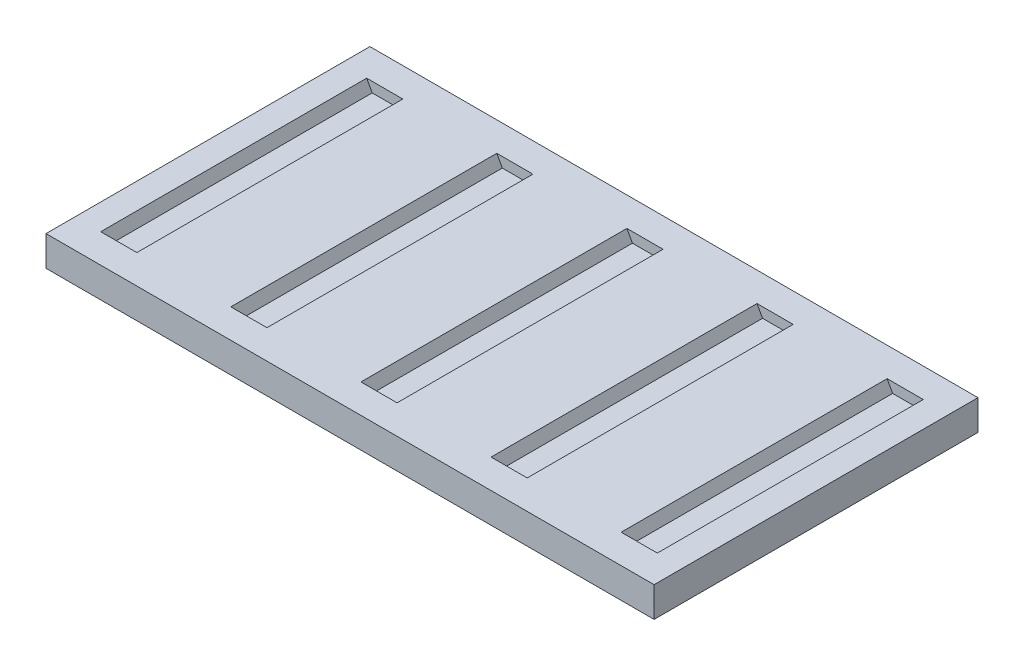
ISO-10303-21;
HEADER;
FILE_DESCRIPTION(('STEP AP214'),'2;1');
FILE_NAME('part.step','',(''),(''),'','','');
FILE_SCHEMA(('AUTOMOTIVE_DESIGN { 1 0 10303 214 1 1 1 1 }'));
ENDSEC;
DATA;
#1=APPLICATION_CONTEXT('core data for automotive mechanical design processes');
#2=APPLICATION_PROTOCOL_DEFINITION('international standard','automotive_design',2000,#1);
#3=PRODUCT_CONTEXT('',#1,'mechanical');
#4=PRODUCT('Part','Part','',(#3));
#5=PRODUCT_RELATED_PRODUCT_CATEGORY('part','',(#4));
#6=PRODUCT_DEFINITION_FORMATION('','',#4);
#7=PRODUCT_DEFINITION_CONTEXT('part definition',#1,'design');
#8=PRODUCT_DEFINITION('design','',#6,#7);
#9=PRODUCT_DEFINITION_SHAPE('','',#8);
#10=(LENGTH_UNIT() NAMED_UNIT(*) SI_UNIT(.MILLI.,.METRE.));
#11=(NAMED_UNIT(*) PLANE_ANGLE_UNIT() SI_UNIT($,.RADIAN.));
#12=(NAMED_UNIT(*) SI_UNIT($,.STERADIAN.) SOLID_ANGLE_UNIT());
#13=UNCERTAINTY_MEASURE_WITH_UNIT(LENGTH_MEASURE(1.E-05),#10,'distance_accuracy_value','');
#14=(GEOMETRIC_REPRESENTATION_CONTEXT(3) GLOBAL_UNCERTAINTY_ASSIGNED_CONTEXT((#13)) GLOBAL_UNIT_ASSIGNED_CONTEXT((#10,
#11,#12)) REPRESENTATION_CONTEXT('',''));
#15=CARTESIAN_POINT('',(0.,0.,0.));
#16=DIRECTION('',(0.,0.,1.));
#17=DIRECTION('',(1.,0.,0.));
#18=AXIS2_PLACEMENT_3D('',#15,#16,#17);
#19=CARTESIAN_POINT('',(242.360715672653,-15.,61.55));
#20=DIRECTION('',(1.,0.,0.));
#21=DIRECTION('',(0.,1.,0.));
#22=AXIS2_PLACEMENT_3D('',#19,#20,#21);
#23=PLANE('',#22);
#24=DIRECTION('',(0.,0.,1.));
#25=VECTOR('',#24,1.);
#26=CARTESIAN_POINT('',(242.360715672653,-6.,-64.55));
#27=LINE('',#26,#25);
#28=CARTESIAN_POINT('',(242.360715672653,-6.,-64.55));
#29=VERTEX_POINT('',#28);
#30=CARTESIAN_POINT('',(242.360715672653,-6.,64.55));
#31=VERTEX_POINT('',#30);
#32=EDGE_CURVE('E318',#29,#31,#27,.T.);
#33=ORIENTED_EDGE('',*,*,#32,.T.);
#34=DIRECTION('',(0.,-1.,0.));
#35=VECTOR('',#34,1.);
#36=CARTESIAN_POINT('',(242.360715672653,-15.,64.55));
#37=LINE('',#36,#35);
#38=CARTESIAN_POINT('',(242.360715672653,-18.,64.5500000000001));
#39=VERTEX_POINT('',#38);
#40=EDGE_CURVE('E341',#31,#39,#37,.T.);
#41=ORIENTED_EDGE('',*,*,#40,.T.);
#42=DIRECTION('',(0.,0.,1.));
#43=VECTOR('',#42,1.);
#44=CARTESIAN_POINT('',(242.360715672653,-18.,-64.55));
#45=LINE('',#44,#43);
#46=CARTESIAN_POINT('',(242.360715672653,-18.,-64.55));
#47=VERTEX_POINT('',#46);
#48=EDGE_CURVE('E321',#47,#39,#45,.T.);
#49=ORIENTED_EDGE('',*,*,#48,.F.);
#50=DIRECTION('',(0.,1.,0.));
#51=VECTOR('',#50,1.);
#52=CARTESIAN_POINT('',(242.360715672653,-18.,-64.55));
#53=LINE('',#52,#51);
#54=EDGE_CURVE('E332',#47,#29,#53,.T.);
#55=ORIENTED_EDGE('',*,*,#54,.T.);
#56=EDGE_LOOP('',(#33,#41,#49,#55));
#57=FACE_BOUND('',#56,.T.);
#58=ADVANCED_FACE('F39',(#57),#23,.T.);
#59=CARTESIAN_POINT('',(0.,-2.97600000000012,61.55));
#60=DIRECTION('',(-1.,0.,0.));
#61=DIRECTION('',(0.,-1.,0.));
#62=AXIS2_PLACEMENT_3D('',#59,#60,#61);
#63=PLANE('',#62);
#64=DIRECTION('',(0.,0.,1.));
#65=VECTOR('',#64,1.);
#66=CARTESIAN_POINT('',(0.,-6.,-64.55));
#67=LINE('',#66,#65);
#68=CARTESIAN_POINT('',(0.,-6.,-64.55));
#69=VERTEX_POINT('',#68);
#70=CARTESIAN_POINT('',(0.,-6.,64.55));
#71=VERTEX_POINT('',#70);
#72=EDGE_CURVE('E316',#69,#71,#67,.T.);
#73=ORIENTED_EDGE('',*,*,#72,.F.);
#74=DIRECTION('',(0.,1.,0.));
#75=VECTOR('',#74,1.);
#76=CARTESIAN_POINT('',(0.,-18.,-64.55));
#77=LINE('',#76,#75);
#78=CARTESIAN_POINT('',(0.,-18.,-64.55));
#79=VERTEX_POINT('',#78);
#80=EDGE_CURVE('E335',#79,#69,#77,.T.);
#81=ORIENTED_EDGE('',*,*,#80,.F.);
#82=DIRECTION('',(0.,0.,-1.));
#83=VECTOR('',#82,1.);
#84=CARTESIAN_POINT('',(0.,-18.,-64.55));
#85=LINE('',#84,#83);
#86=CARTESIAN_POINT('',(0.,-18.,64.55));
#87=VERTEX_POINT('',#86);
#88=EDGE_CURVE('E328',#87,#79,#85,.T.);
#89=ORIENTED_EDGE('',*,*,#88,.F.);
#90=DIRECTION('',(0.,1.,0.));
#91=VECTOR('',#90,1.);
#92=CARTESIAN_POINT('',(0.,-15.,64.55));
#93=LINE('',#92,#91);
#94=EDGE_CURVE('E338',#87,#71,#93,.T.);
#95=ORIENTED_EDGE('',*,*,#94,.T.);
#96=EDGE_LOOP('',(#73,#81,#89,#95));
#97=FACE_BOUND('',#96,.T.);
#98=ADVANCED_FACE('F41',(#97),#63,.T.);
#99=CARTESIAN_POINT('',(0.,0.,64.55));
#100=DIRECTION('',(0.,0.,1.));
#101=DIRECTION('',(-1.,0.,0.));
#102=AXIS2_PLACEMENT_3D('',#99,#100,#101);
#103=PLANE('',#102);
#104=DIRECTION('',(1.,0.,0.));
#105=VECTOR('',#104,1.);
#106=CARTESIAN_POINT('',(0.,-6.,64.55));
#107=LINE('',#106,#105);
#108=EDGE_CURVE('E229',#71,#31,#107,.T.);
#109=ORIENTED_EDGE('',*,*,#108,.F.);
#110=ORIENTED_EDGE('',*,*,#94,.F.);
#111=DIRECTION('',(-1.,0.,0.));
#112=VECTOR('',#111,1.);
#113=CARTESIAN_POINT('',(242.360715672653,-18.,64.5500000000001));
#114=LINE('',#113,#112);
#115=EDGE_CURVE('E325',#39,#87,#114,.T.);
#116=ORIENTED_EDGE('',*,*,#115,.F.);
#117=ORIENTED_EDGE('',*,*,#40,.F.);
#118=EDGE_LOOP('',(#109,#110,#116,#117));
#119=FACE_BOUND('',#118,.T.);
#120=ADVANCED_FACE('F415',(#119),#103,.T.);
#121=CARTESIAN_POINT('',(0.,-18.,0.));
#122=DIRECTION('',(0.,-1.,0.));
#123=DIRECTION('',(1.,0.,0.));
#124=AXIS2_PLACEMENT_3D('',#121,#122,#123);
#125=PLANE('',#124);
#126=ORIENTED_EDGE('',*,*,#88,.T.);
#127=DIRECTION('',(1.,0.,0.));
#128=VECTOR('',#127,1.);
#129=CARTESIAN_POINT('',(242.360715672653,-18.,-64.55));
#130=LINE('',#129,#128);
#131=EDGE_CURVE('E330',#79,#47,#130,.T.);
#132=ORIENTED_EDGE('',*,*,#131,.T.);
#133=ORIENTED_EDGE('',*,*,#48,.T.);
#134=ORIENTED_EDGE('',*,*,#115,.T.);
#135=EDGE_LOOP('',(#126,#132,#133,#134));
#136=FACE_BOUND('',#135,.T.);
#137=ADVANCED_FACE('F420',(#136),#125,.T.);
#138=CARTESIAN_POINT('',(242.360715672653,-18.,-64.55));
#139=DIRECTION('',(0.,0.,1.));
#140=DIRECTION('',(1.,0.,0.));
#141=AXIS2_PLACEMENT_3D('',#138,#139,#140);
#142=PLANE('',#141);
#143=ORIENTED_EDGE('',*,*,#80,.T.);
#144=DIRECTION('',(1.,0.,0.));
#145=VECTOR('',#144,1.);
#146=CARTESIAN_POINT('',(0.,-6.,-64.55));
#147=LINE('',#146,#145);
#148=EDGE_CURVE('E313',#69,#29,#147,.T.);
#149=ORIENTED_EDGE('',*,*,#148,.T.);
#150=ORIENTED_EDGE('',*,*,#54,.F.);
#151=ORIENTED_EDGE('',*,*,#131,.F.);
#152=EDGE_LOOP('',(#143,#149,#150,#151));
#153=FACE_BOUND('',#152,.T.);
#154=ADVANCED_FACE('F422',(#153),#142,.F.);
#155=CARTESIAN_POINT('',(0.,-6.,-64.55));
#156=DIRECTION('',(0.,-1.,0.));
#157=DIRECTION('',(0.,0.,-1.));
#158=AXIS2_PLACEMENT_3D('',#155,#156,#157);
#159=PLANE('',#158);
#160=DIRECTION('',(0.,0.,-1.));
#161=VECTOR('',#160,1.);
#162=CARTESIAN_POINT('',(10.2603578363264,-6.,-64.55));
#163=LINE('',#162,#161);
#164=CARTESIAN_POINT('',(10.2603578363264,-6.,53.));
#165=VERTEX_POINT('',#164);
#166=CARTESIAN_POINT('',(10.2603578363264,-6.,-53.));
#167=VERTEX_POINT('',#166);
#168=EDGE_CURVE('E47',#165,#167,#163,.T.);
#169=ORIENTED_EDGE('',*,*,#168,.T.);
#170=DIRECTION('',(1.,0.,0.));
#171=VECTOR('',#170,1.);
#172=CARTESIAN_POINT('',(0.,-6.,-53.));
#173=LINE('',#172,#171);
#174=CARTESIAN_POINT('',(24.6603578363263,-6.,-53.));
#175=VERTEX_POINT('',#174);
#176=EDGE_CURVE('E12',#167,#175,#173,.T.);
#177=ORIENTED_EDGE('',*,*,#176,.T.);
#178=DIRECTION('',(0.,0.,1.));
#179=VECTOR('',#178,1.);
#180=CARTESIAN_POINT('',(24.6603578363263,-6.,-64.55));
#181=LINE('',#180,#179);
#182=CARTESIAN_POINT('',(24.6603578363263,-6.,53.));
#183=VERTEX_POINT('',#182);
#184=EDGE_CURVE('E389',#175,#183,#181,.T.);
#185=ORIENTED_EDGE('',*,*,#184,.T.);
#186=DIRECTION('',(1.,0.,0.));
#187=VECTOR('',#186,1.);
#188=CARTESIAN_POINT('',(0.,-6.,53.));
#189=LINE('',#188,#187);
#190=EDGE_CURVE('E387',#165,#183,#189,.T.);
#191=ORIENTED_EDGE('',*,*,#190,.F.);
#192=EDGE_LOOP('',(#169,#177,#185,#191));
#193=FACE_BOUND('',#192,.T.);
#194=DIRECTION('',(0.,0.,-1.));
#195=VECTOR('',#194,1.);
#196=CARTESIAN_POINT('',(62.1203578363263,-6.,-64.55));
#197=LINE('',#196,#195);
#198=CARTESIAN_POINT('',(62.1203578363263,-6.,53.));
#199=VERTEX_POINT('',#198);
#200=CARTESIAN_POINT('',(62.1203578363263,-6.,-53.));
#201=VERTEX_POINT('',#200);
#202=EDGE_CURVE('E381',#199,#201,#197,.T.);
#203=ORIENTED_EDGE('',*,*,#202,.T.);
#204=DIRECTION('',(1.,0.,0.));
#205=VECTOR('',#204,1.);
#206=CARTESIAN_POINT('',(0.,-6.,-53.));
#207=LINE('',#206,#205);
#208=CARTESIAN_POINT('',(76.5203578363263,-6.,-53.));
#209=VERTEX_POINT('',#208);
#210=EDGE_CURVE('E384',#201,#209,#207,.T.);
#211=ORIENTED_EDGE('',*,*,#210,.T.);
#212=DIRECTION('',(0.,0.,1.));
#213=VECTOR('',#212,1.);
#214=CARTESIAN_POINT('',(76.5203578363263,-6.,-64.55));
#215=LINE('',#214,#213);
#216=CARTESIAN_POINT('',(76.5203578363263,-6.,53.));
#217=VERTEX_POINT('',#216);
#218=EDGE_CURVE('E378',#209,#217,#215,.T.);
#219=ORIENTED_EDGE('',*,*,#218,.T.);
#220=DIRECTION('',(1.,0.,0.));
#221=VECTOR('',#220,1.);
#222=CARTESIAN_POINT('',(0.,-6.,53.));
#223=LINE('',#222,#221);
#224=EDGE_CURVE('E376',#199,#217,#223,.T.);
#225=ORIENTED_EDGE('',*,*,#224,.F.);
#226=EDGE_LOOP('',(#203,#211,#219,#225));
#227=FACE_BOUND('',#226,.T.);
#228=DIRECTION('',(0.,0.,-1.));
#229=VECTOR('',#228,1.);
#230=CARTESIAN_POINT('',(113.980357836326,-6.,-64.55));
#231=LINE('',#230,#229);
#232=CARTESIAN_POINT('',(113.980357836326,-6.,53.));
#233=VERTEX_POINT('',#232);
#234=CARTESIAN_POINT('',(113.980357836326,-6.,-53.));
#235=VERTEX_POINT('',#234);
#236=EDGE_CURVE('E370',#233,#235,#231,.T.);
#237=ORIENTED_EDGE('',*,*,#236,.T.);
#238=DIRECTION('',(1.,0.,0.));
#239=VECTOR('',#238,1.);
#240=CARTESIAN_POINT('',(0.,-6.,-53.));
#241=LINE('',#240,#239);
#242=CARTESIAN_POINT('',(128.380357836326,-6.,-53.));
#243=VERTEX_POINT('',#242);
#244=EDGE_CURVE('E373',#235,#243,#241,.T.);
#245=ORIENTED_EDGE('',*,*,#244,.T.);
#246=DIRECTION('',(0.,0.,1.));
#247=VECTOR('',#246,1.);
#248=CARTESIAN_POINT('',(128.380357836326,-6.,-64.55));
#249=LINE('',#248,#247);
#250=CARTESIAN_POINT('',(128.380357836326,-6.,53.));
#251=VERTEX_POINT('',#250);
#252=EDGE_CURVE('E367',#243,#251,#249,.T.);
#253=ORIENTED_EDGE('',*,*,#252,.T.);
#254=DIRECTION('',(1.,0.,0.));
#255=VECTOR('',#254,1.);
#256=CARTESIAN_POINT('',(0.,-6.,53.));
#257=LINE('',#256,#255);
#258=EDGE_CURVE('E365',#233,#251,#257,.T.);
#259=ORIENTED_EDGE('',*,*,#258,.F.);
#260=EDGE_LOOP('',(#237,#245,#253,#259));
#261=FACE_BOUND('',#260,.T.);
#262=DIRECTION('',(0.,0.,-1.));
#263=VECTOR('',#262,1.);
#264=CARTESIAN_POINT('',(165.840357836326,-6.,-64.55));
#265=LINE('',#264,#263);
#266=CARTESIAN_POINT('',(165.840357836326,-6.,53.));
#267=VERTEX_POINT('',#266);
#268=CARTESIAN_POINT('',(165.840357836326,-6.,-53.));
#269=VERTEX_POINT('',#268);
#270=EDGE_CURVE('E359',#267,#269,#265,.T.);
#271=ORIENTED_EDGE('',*,*,#270,.T.);
#272=DIRECTION('',(1.,0.,0.));
#273=VECTOR('',#272,1.);
#274=CARTESIAN_POINT('',(0.,-6.,-53.));
#275=LINE('',#274,#273);
#276=CARTESIAN_POINT('',(180.240357836326,-6.,-53.));
#277=VERTEX_POINT('',#276);
#278=EDGE_CURVE('E362',#269,#277,#275,.T.);
#279=ORIENTED_EDGE('',*,*,#278,.T.);
#280=DIRECTION('',(0.,0.,1.));
#281=VECTOR('',#280,1.);
#282=CARTESIAN_POINT('',(180.240357836326,-6.,-64.55));
#283=LINE('',#282,#281);
#284=CARTESIAN_POINT('',(180.240357836326,-6.,53.));
#285=VERTEX_POINT('',#284);
#286=EDGE_CURVE('E356',#277,#285,#283,.T.);
#287=ORIENTED_EDGE('',*,*,#286,.T.);
#288=DIRECTION('',(1.,0.,0.));
#289=VECTOR('',#288,1.);
#290=CARTESIAN_POINT('',(0.,-6.,53.));
#291=LINE('',#290,#289);
#292=EDGE_CURVE('E354',#267,#285,#291,.T.);
#293=ORIENTED_EDGE('',*,*,#292,.F.);
#294=EDGE_LOOP('',(#271,#279,#287,#293));
#295=FACE_BOUND('',#294,.T.);
#296=DIRECTION('',(0.,0.,-1.));
#297=VECTOR('',#296,1.);
#298=CARTESIAN_POINT('',(217.700357836326,-6.,-64.55));
#299=LINE('',#298,#297);
#300=CARTESIAN_POINT('',(217.700357836326,-6.,53.));
#301=VERTEX_POINT('',#300);
#302=CARTESIAN_POINT('',(217.700357836326,-6.,-53.));
#303=VERTEX_POINT('',#302);
#304=EDGE_CURVE('E348',#301,#303,#299,.T.);
#305=ORIENTED_EDGE('',*,*,#304,.T.);
#306=DIRECTION('',(1.,0.,0.));
#307=VECTOR('',#306,1.);
#308=CARTESIAN_POINT('',(0.,-6.,-53.));
#309=LINE('',#308,#307);
#310=CARTESIAN_POINT('',(232.100357836326,-6.,-53.));
#311=VERTEX_POINT('',#310);
#312=EDGE_CURVE('E351',#303,#311,#309,.T.);
#313=ORIENTED_EDGE('',*,*,#312,.T.);
#314=DIRECTION('',(0.,0.,1.));
#315=VECTOR('',#314,1.);
#316=CARTESIAN_POINT('',(232.100357836326,-6.,-64.55));
#317=LINE('',#316,#315);
#318=CARTESIAN_POINT('',(232.100357836326,-6.,53.));
#319=VERTEX_POINT('',#318);
#320=EDGE_CURVE('E345',#311,#319,#317,.T.);
#321=ORIENTED_EDGE('',*,*,#320,.T.);
#322=DIRECTION('',(1.,0.,0.));
#323=VECTOR('',#322,1.);
#324=CARTESIAN_POINT('',(0.,-6.,53.));
#325=LINE('',#324,#323);
#326=EDGE_CURVE('E343',#301,#319,#325,.T.);
#327=ORIENTED_EDGE('',*,*,#326,.F.);
#328=EDGE_LOOP('',(#305,#313,#321,#327));
#329=FACE_BOUND('',#328,.T.);
#330=ORIENTED_EDGE('',*,*,#108,.T.);
#331=ORIENTED_EDGE('',*,*,#32,.F.);
#332=ORIENTED_EDGE('',*,*,#148,.F.);
#333=ORIENTED_EDGE('',*,*,#72,.T.);
#334=EDGE_LOOP('',(#330,#331,#332,#333));
#335=FACE_BOUND('',#334,.T.);
#336=ADVANCED_FACE('F393',(#193,#227,#261,#295,#329,#335),#159,.F.);
#337=CARTESIAN_POINT('',(219.900357836326,-9.99999999999997,-53.));
#338=DIRECTION('',(-0.876215908676645,-0.48191874977216,0.));
#339=DIRECTION('',(0.48191874977216,-0.876215908676645,0.));
#340=AXIS2_PLACEMENT_3D('',#337,#338,#339);
#341=PLANE('',#340);
#342=DIRECTION('',(0.48191874977216,-0.876215908676645,0.));
#343=VECTOR('',#342,1.);
#344=CARTESIAN_POINT('',(219.900357836326,-9.99999999999997,53.));
#345=LINE('',#344,#343);
#346=CARTESIAN_POINT('',(219.900357836326,-9.99999999999997,53.));
#347=VERTEX_POINT('',#346);
#348=EDGE_CURVE('E303',#301,#347,#345,.T.);
#349=ORIENTED_EDGE('',*,*,#348,.T.);
#350=DIRECTION('',(0.,0.,1.));
#351=VECTOR('',#350,1.);
#352=CARTESIAN_POINT('',(219.900357836326,-9.99999999999997,-53.));
#353=LINE('',#352,#351);
#354=CARTESIAN_POINT('',(219.900357836326,-9.99999999999997,-53.));
#355=VERTEX_POINT('',#354);
#356=EDGE_CURVE('E302',#355,#347,#353,.T.);
#357=ORIENTED_EDGE('',*,*,#356,.F.);
#358=DIRECTION('',(0.48191874977216,-0.876215908676645,0.));
#359=VECTOR('',#358,1.);
#360=CARTESIAN_POINT('',(219.900357836326,-9.99999999999997,-53.));
#361=LINE('',#360,#359);
#362=EDGE_CURVE('E293',#303,#355,#361,.T.);
#363=ORIENTED_EDGE('',*,*,#362,.F.);
#364=ORIENTED_EDGE('',*,*,#304,.F.);
#365=EDGE_LOOP('',(#349,#357,#363,#364));
#366=FACE_BOUND('',#365,.T.);
#367=ADVANCED_FACE('F431',(#366),#341,.F.);
#368=CARTESIAN_POINT('',(235.400357836326,0.,-53.));
#369=DIRECTION('',(0.876215908676649,-0.481918749772153,0.));
#370=DIRECTION('',(0.481918749772153,0.876215908676649,0.));
#371=AXIS2_PLACEMENT_3D('',#368,#369,#370);
#372=PLANE('',#371);
#373=DIRECTION('',(0.481918749772153,0.876215908676649,0.));
#374=VECTOR('',#373,1.);
#375=CARTESIAN_POINT('',(235.400357836326,0.,-53.));
#376=LINE('',#375,#374);
#377=CARTESIAN_POINT('',(229.900357836326,-9.99999999999997,-53.));
#378=VERTEX_POINT('',#377);
#379=EDGE_CURVE('E299',#378,#311,#376,.T.);
#380=ORIENTED_EDGE('',*,*,#379,.F.);
#381=DIRECTION('',(0.,0.,1.));
#382=VECTOR('',#381,1.);
#383=CARTESIAN_POINT('',(229.900357836326,-9.99999999999997,-53.));
#384=LINE('',#383,#382);
#385=CARTESIAN_POINT('',(229.900357836326,-9.99999999999997,53.));
#386=VERTEX_POINT('',#385);
#387=EDGE_CURVE('E285',#378,#386,#384,.T.);
#388=ORIENTED_EDGE('',*,*,#387,.T.);
#389=DIRECTION('',(0.481918749772153,0.876215908676649,0.));
#390=VECTOR('',#389,1.);
#391=CARTESIAN_POINT('',(235.400357836326,0.,53.));
#392=LINE('',#391,#390);
#393=EDGE_CURVE('E296',#386,#319,#392,.T.);
#394=ORIENTED_EDGE('',*,*,#393,.T.);
#395=ORIENTED_EDGE('',*,*,#320,.F.);
#396=EDGE_LOOP('',(#380,#388,#394,#395));
#397=FACE_BOUND('',#396,.T.);
#398=ADVANCED_FACE('F434',(#397),#372,.F.);
#399=CARTESIAN_POINT('',(0.,0.,-53.));
#400=DIRECTION('',(0.,0.,-1.));
#401=DIRECTION('',(-1.,0.,0.));
#402=AXIS2_PLACEMENT_3D('',#399,#400,#401);
#403=PLANE('',#402);
#404=ORIENTED_EDGE('',*,*,#362,.T.);
#405=DIRECTION('',(1.,0.,0.));
#406=VECTOR('',#405,1.);
#407=CARTESIAN_POINT('',(229.900357836326,-9.99999999999997,-53.));
#408=LINE('',#407,#406);
#409=EDGE_CURVE('E295',#355,#378,#408,.T.);
#410=ORIENTED_EDGE('',*,*,#409,.T.);
#411=ORIENTED_EDGE('',*,*,#379,.T.);
#412=ORIENTED_EDGE('',*,*,#312,.F.);
#413=EDGE_LOOP('',(#404,#410,#411,#412));
#414=FACE_BOUND('',#413,.T.);
#415=ADVANCED_FACE('F444',(#414),#403,.F.);
#416=CARTESIAN_POINT('',(0.,0.,53.));
#417=DIRECTION('',(0.,0.,-1.));
#418=DIRECTION('',(-1.,0.,0.));
#419=AXIS2_PLACEMENT_3D('',#416,#417,#418);
#420=PLANE('',#419);
#421=ORIENTED_EDGE('',*,*,#326,.T.);
#422=ORIENTED_EDGE('',*,*,#393,.F.);
#423=DIRECTION('',(1.,0.,0.));
#424=VECTOR('',#423,1.);
#425=CARTESIAN_POINT('',(229.900357836326,-9.99999999999997,53.));
#426=LINE('',#425,#424);
#427=EDGE_CURVE('E305',#347,#386,#426,.T.);
#428=ORIENTED_EDGE('',*,*,#427,.F.);
#429=ORIENTED_EDGE('',*,*,#348,.F.);
#430=EDGE_LOOP('',(#421,#422,#428,#429));
#431=FACE_BOUND('',#430,.T.);
#432=ADVANCED_FACE('F440',(#431),#420,.T.);
#433=CARTESIAN_POINT('',(229.900357836326,-9.99999999999997,-53.));
#434=DIRECTION('',(0.,-1.,0.));
#435=DIRECTION('',(0.,0.,-1.));
#436=AXIS2_PLACEMENT_3D('',#433,#434,#435);
#437=PLANE('',#436);
#438=ORIENTED_EDGE('',*,*,#427,.T.);
#439=ORIENTED_EDGE('',*,*,#387,.F.);
#440=ORIENTED_EDGE('',*,*,#409,.F.);
#441=ORIENTED_EDGE('',*,*,#356,.T.);
#442=EDGE_LOOP('',(#438,#439,#440,#441));
#443=FACE_BOUND('',#442,.T.);
#444=ADVANCED_FACE('F436',(#443),#437,.F.);
#445=CARTESIAN_POINT('',(168.040357836326,-9.99999999999997,-53.));
#446=DIRECTION('',(-0.876215908676646,-0.481918749772158,0.));
#447=DIRECTION('',(0.481918749772158,-0.876215908676646,0.));
#448=AXIS2_PLACEMENT_3D('',#445,#446,#447);
#449=PLANE('',#448);
#450=DIRECTION('',(0.481918749772158,-0.876215908676646,0.));
#451=VECTOR('',#450,1.);
#452=CARTESIAN_POINT('',(168.040357836326,-9.99999999999997,53.));
#453=LINE('',#452,#451);
#454=CARTESIAN_POINT('',(168.040357836326,-9.99999999999997,53.));
#455=VERTEX_POINT('',#454);
#456=EDGE_CURVE('E282',#267,#455,#453,.T.);
#457=ORIENTED_EDGE('',*,*,#456,.T.);
#458=DIRECTION('',(0.,0.,1.));
#459=VECTOR('',#458,1.);
#460=CARTESIAN_POINT('',(168.040357836326,-9.99999999999997,-53.));
#461=LINE('',#460,#459);
#462=CARTESIAN_POINT('',(168.040357836326,-9.99999999999997,-53.));
#463=VERTEX_POINT('',#462);
#464=EDGE_CURVE('E281',#463,#455,#461,.T.);
#465=ORIENTED_EDGE('',*,*,#464,.F.);
#466=DIRECTION('',(0.481918749772158,-0.876215908676646,0.));
#467=VECTOR('',#466,1.);
#468=CARTESIAN_POINT('',(168.040357836326,-9.99999999999997,-53.));
#469=LINE('',#468,#467);
#470=EDGE_CURVE('E272',#269,#463,#469,.T.);
#471=ORIENTED_EDGE('',*,*,#470,.F.);
#472=ORIENTED_EDGE('',*,*,#270,.F.);
#473=EDGE_LOOP('',(#457,#465,#471,#472));
#474=FACE_BOUND('',#473,.T.);
#475=ADVANCED_FACE('F439',(#474),#449,.F.);
#476=CARTESIAN_POINT('',(183.540357836326,0.,-53.));
#477=DIRECTION('',(0.876215908676648,-0.481918749772154,0.));
#478=DIRECTION('',(0.481918749772154,0.876215908676648,0.));
#479=AXIS2_PLACEMENT_3D('',#476,#477,#478);
#480=PLANE('',#479);
#481=DIRECTION('',(0.481918749772154,0.876215908676648,0.));
#482=VECTOR('',#481,1.);
#483=CARTESIAN_POINT('',(183.540357836326,0.,-53.));
#484=LINE('',#483,#482);
#485=CARTESIAN_POINT('',(178.040357836326,-9.99999999999997,-53.));
#486=VERTEX_POINT('',#485);
#487=EDGE_CURVE('E278',#486,#277,#484,.T.);
#488=ORIENTED_EDGE('',*,*,#487,.F.);
#489=DIRECTION('',(0.,0.,1.));
#490=VECTOR('',#489,1.);
#491=CARTESIAN_POINT('',(178.040357836326,-9.99999999999997,-53.));
#492=LINE('',#491,#490);
#493=CARTESIAN_POINT('',(178.040357836326,-9.99999999999997,53.));
#494=VERTEX_POINT('',#493);
#495=EDGE_CURVE('E264',#486,#494,#492,.T.);
#496=ORIENTED_EDGE('',*,*,#495,.T.);
#497=DIRECTION('',(0.481918749772154,0.876215908676648,0.));
#498=VECTOR('',#497,1.);
#499=CARTESIAN_POINT('',(183.540357836326,0.,53.));
#500=LINE('',#499,#498);
#501=EDGE_CURVE('E275',#494,#285,#500,.T.);
#502=ORIENTED_EDGE('',*,*,#501,.T.);
#503=ORIENTED_EDGE('',*,*,#286,.F.);
#504=EDGE_LOOP('',(#488,#496,#502,#503));
#505=FACE_BOUND('',#504,.T.);
#506=ADVANCED_FACE('F454',(#505),#480,.F.);
#507=CARTESIAN_POINT('',(0.,0.,-53.));
#508=DIRECTION('',(0.,0.,-1.));
#509=DIRECTION('',(-1.,0.,0.));
#510=AXIS2_PLACEMENT_3D('',#507,#508,#509);
#511=PLANE('',#510);
#512=ORIENTED_EDGE('',*,*,#470,.T.);
#513=DIRECTION('',(1.,0.,0.));
#514=VECTOR('',#513,1.);
#515=CARTESIAN_POINT('',(178.040357836326,-9.99999999999997,-53.));
#516=LINE('',#515,#514);
#517=EDGE_CURVE('E274',#463,#486,#516,.T.);
#518=ORIENTED_EDGE('',*,*,#517,.T.);
#519=ORIENTED_EDGE('',*,*,#487,.T.);
#520=ORIENTED_EDGE('',*,*,#278,.F.);
#521=EDGE_LOOP('',(#512,#518,#519,#520));
#522=FACE_BOUND('',#521,.T.);
#523=ADVANCED_FACE('F464',(#522),#511,.F.);
#524=CARTESIAN_POINT('',(0.,0.,53.));
#525=DIRECTION('',(0.,0.,-1.));
#526=DIRECTION('',(-1.,0.,0.));
#527=AXIS2_PLACEMENT_3D('',#524,#525,#526);
#528=PLANE('',#527);
#529=ORIENTED_EDGE('',*,*,#292,.T.);
#530=ORIENTED_EDGE('',*,*,#501,.F.);
#531=DIRECTION('',(1.,0.,0.));
#532=VECTOR('',#531,1.);
#533=CARTESIAN_POINT('',(178.040357836326,-9.99999999999997,53.));
#534=LINE('',#533,#532);
#535=EDGE_CURVE('E284',#455,#494,#534,.T.);
#536=ORIENTED_EDGE('',*,*,#535,.F.);
#537=ORIENTED_EDGE('',*,*,#456,.F.);
#538=EDGE_LOOP('',(#529,#530,#536,#537));
#539=FACE_BOUND('',#538,.T.);
#540=ADVANCED_FACE('F460',(#539),#528,.T.);
#541=CARTESIAN_POINT('',(178.040357836326,-9.99999999999997,-53.));
#542=DIRECTION('',(0.,-1.,0.));
#543=DIRECTION('',(0.,0.,-1.));
#544=AXIS2_PLACEMENT_3D('',#541,#542,#543);
#545=PLANE('',#544);
#546=ORIENTED_EDGE('',*,*,#535,.T.);
#547=ORIENTED_EDGE('',*,*,#495,.F.);
#548=ORIENTED_EDGE('',*,*,#517,.F.);
#549=ORIENTED_EDGE('',*,*,#464,.T.);
#550=EDGE_LOOP('',(#546,#547,#548,#549));
#551=FACE_BOUND('',#550,.T.);
#552=ADVANCED_FACE('F456',(#551),#545,.F.);
#553=CARTESIAN_POINT('',(116.180357836326,-9.99999999999997,-53.));
#554=DIRECTION('',(-0.876215908676646,-0.481918749772157,0.));
#555=DIRECTION('',(0.481918749772157,-0.876215908676646,0.));
#556=AXIS2_PLACEMENT_3D('',#553,#554,#555);
#557=PLANE('',#556);
#558=DIRECTION('',(0.481918749772157,-0.876215908676646,0.));
#559=VECTOR('',#558,1.);
#560=CARTESIAN_POINT('',(116.180357836326,-9.99999999999997,53.));
#561=LINE('',#560,#559);
#562=CARTESIAN_POINT('',(116.180357836326,-9.99999999999997,53.));
#563=VERTEX_POINT('',#562);
#564=EDGE_CURVE('E261',#233,#563,#561,.T.);
#565=ORIENTED_EDGE('',*,*,#564,.T.);
#566=DIRECTION('',(0.,0.,1.));
#567=VECTOR('',#566,1.);
#568=CARTESIAN_POINT('',(116.180357836326,-9.99999999999997,-53.));
#569=LINE('',#568,#567);
#570=CARTESIAN_POINT('',(116.180357836326,-9.99999999999997,-53.));
#571=VERTEX_POINT('',#570);
#572=EDGE_CURVE('E260',#571,#563,#569,.T.);
#573=ORIENTED_EDGE('',*,*,#572,.F.);
#574=DIRECTION('',(0.481918749772157,-0.876215908676646,0.));
#575=VECTOR('',#574,1.);
#576=CARTESIAN_POINT('',(116.180357836326,-9.99999999999997,-53.));
#577=LINE('',#576,#575);
#578=EDGE_CURVE('E251',#235,#571,#577,.T.);
#579=ORIENTED_EDGE('',*,*,#578,.F.);
#580=ORIENTED_EDGE('',*,*,#236,.F.);
#581=EDGE_LOOP('',(#565,#573,#579,#580));
#582=FACE_BOUND('',#581,.T.);
#583=ADVANCED_FACE('F459',(#582),#557,.F.);
#584=CARTESIAN_POINT('',(131.680357836326,0.,-53.));
#585=DIRECTION('',(0.876215908676648,-0.481918749772154,0.));
#586=DIRECTION('',(0.481918749772154,0.876215908676648,0.));
#587=AXIS2_PLACEMENT_3D('',#584,#585,#586);
#588=PLANE('',#587);
#589=DIRECTION('',(0.481918749772154,0.876215908676648,0.));
#590=VECTOR('',#589,1.);
#591=CARTESIAN_POINT('',(131.680357836326,0.,-53.));
#592=LINE('',#591,#590);
#593=CARTESIAN_POINT('',(126.180357836326,-9.99999999999997,-53.));
#594=VERTEX_POINT('',#593);
#595=EDGE_CURVE('E257',#594,#243,#592,.T.);
#596=ORIENTED_EDGE('',*,*,#595,.F.);
#597=DIRECTION('',(0.,0.,1.));
#598=VECTOR('',#597,1.);
#599=CARTESIAN_POINT('',(126.180357836326,-9.99999999999997,-53.));
#600=LINE('',#599,#598);
#601=CARTESIAN_POINT('',(126.180357836326,-9.99999999999997,53.));
#602=VERTEX_POINT('',#601);
#603=EDGE_CURVE('E243',#594,#602,#600,.T.);
#604=ORIENTED_EDGE('',*,*,#603,.T.);
#605=DIRECTION('',(0.481918749772154,0.876215908676648,0.));
#606=VECTOR('',#605,1.);
#607=CARTESIAN_POINT('',(131.680357836326,0.,53.));
#608=LINE('',#607,#606);
#609=EDGE_CURVE('E254',#602,#251,#608,.T.);
#610=ORIENTED_EDGE('',*,*,#609,.T.);
#611=ORIENTED_EDGE('',*,*,#252,.F.);
#612=EDGE_LOOP('',(#596,#604,#610,#611));
#613=FACE_BOUND('',#612,.T.);
#614=ADVANCED_FACE('F474',(#613),#588,.F.);
#615=CARTESIAN_POINT('',(0.,0.,-53.));
#616=DIRECTION('',(0.,0.,-1.));
#617=DIRECTION('',(-1.,0.,0.));
#618=AXIS2_PLACEMENT_3D('',#615,#616,#617);
#619=PLANE('',#618);
#620=ORIENTED_EDGE('',*,*,#578,.T.);
#621=DIRECTION('',(1.,0.,0.));
#622=VECTOR('',#621,1.);
#623=CARTESIAN_POINT('',(126.180357836326,-9.99999999999997,-53.));
#624=LINE('',#623,#622);
#625=EDGE_CURVE('E253',#571,#594,#624,.T.);
#626=ORIENTED_EDGE('',*,*,#625,.T.);
#627=ORIENTED_EDGE('',*,*,#595,.T.);
#628=ORIENTED_EDGE('',*,*,#244,.F.);
#629=EDGE_LOOP('',(#620,#626,#627,#628));
#630=FACE_BOUND('',#629,.T.);
#631=ADVANCED_FACE('F484',(#630),#619,.F.);
#632=CARTESIAN_POINT('',(0.,0.,53.));
#633=DIRECTION('',(0.,0.,-1.));
#634=DIRECTION('',(-1.,0.,0.));
#635=AXIS2_PLACEMENT_3D('',#632,#633,#634);
#636=PLANE('',#635);
#637=ORIENTED_EDGE('',*,*,#258,.T.);
#638=ORIENTED_EDGE('',*,*,#609,.F.);
#639=DIRECTION('',(1.,0.,0.));
#640=VECTOR('',#639,1.);
#641=CARTESIAN_POINT('',(126.180357836326,-9.99999999999997,53.));
#642=LINE('',#641,#640);
#643=EDGE_CURVE('E263',#563,#602,#642,.T.);
#644=ORIENTED_EDGE('',*,*,#643,.F.);
#645=ORIENTED_EDGE('',*,*,#564,.F.);
#646=EDGE_LOOP('',(#637,#638,#644,#645));
#647=FACE_BOUND('',#646,.T.);
#648=ADVANCED_FACE('F480',(#647),#636,.T.);
#649=CARTESIAN_POINT('',(126.180357836326,-9.99999999999997,-53.));
#650=DIRECTION('',(0.,-1.,0.));
#651=DIRECTION('',(0.,0.,-1.));
#652=AXIS2_PLACEMENT_3D('',#649,#650,#651);
#653=PLANE('',#652);
#654=ORIENTED_EDGE('',*,*,#643,.T.);
#655=ORIENTED_EDGE('',*,*,#603,.F.);
#656=ORIENTED_EDGE('',*,*,#625,.F.);
#657=ORIENTED_EDGE('',*,*,#572,.T.);
#658=EDGE_LOOP('',(#654,#655,#656,#657));
#659=FACE_BOUND('',#658,.T.);
#660=ADVANCED_FACE('F476',(#659),#653,.F.);
#661=CARTESIAN_POINT('',(64.3203578363263,-9.99999999999997,-53.));
#662=DIRECTION('',(-0.876215908676647,-0.481918749772157,0.));
#663=DIRECTION('',(0.481918749772157,-0.876215908676647,0.));
#664=AXIS2_PLACEMENT_3D('',#661,#662,#663);
#665=PLANE('',#664);
#666=DIRECTION('',(0.481918749772157,-0.876215908676647,0.));
#667=VECTOR('',#666,1.);
#668=CARTESIAN_POINT('',(64.3203578363263,-9.99999999999997,53.));
#669=LINE('',#668,#667);
#670=CARTESIAN_POINT('',(64.3203578363263,-9.99999999999997,53.));
#671=VERTEX_POINT('',#670);
#672=EDGE_CURVE('E62',#199,#671,#669,.T.);
#673=ORIENTED_EDGE('',*,*,#672,.T.);
#674=DIRECTION('',(0.,0.,1.));
#675=VECTOR('',#674,1.);
#676=CARTESIAN_POINT('',(64.3203578363263,-9.99999999999997,-53.));
#677=LINE('',#676,#675);
#678=CARTESIAN_POINT('',(64.3203578363263,-9.99999999999997,-53.));
#679=VERTEX_POINT('',#678);
#680=EDGE_CURVE('E240',#679,#671,#677,.T.);
#681=ORIENTED_EDGE('',*,*,#680,.F.);
#682=DIRECTION('',(0.481918749772157,-0.876215908676647,0.));
#683=VECTOR('',#682,1.);
#684=CARTESIAN_POINT('',(64.3203578363263,-9.99999999999997,-53.));
#685=LINE('',#684,#683);
#686=EDGE_CURVE('E231',#201,#679,#685,.T.);
#687=ORIENTED_EDGE('',*,*,#686,.F.);
#688=ORIENTED_EDGE('',*,*,#202,.F.);
#689=EDGE_LOOP('',(#673,#681,#687,#688));
#690=FACE_BOUND('',#689,.T.);
#691=ADVANCED_FACE('F479',(#690),#665,.F.);
#692=CARTESIAN_POINT('',(79.8203578363263,0.,-53.));
#693=DIRECTION('',(0.876215908676648,-0.481918749772154,0.));
#694=DIRECTION('',(0.481918749772154,0.876215908676648,0.));
#695=AXIS2_PLACEMENT_3D('',#692,#693,#694);
#696=PLANE('',#695);
#697=DIRECTION('',(0.481918749772154,0.876215908676648,0.));
#698=VECTOR('',#697,1.);
#699=CARTESIAN_POINT('',(79.8203578363263,0.,-53.));
#700=LINE('',#699,#698);
#701=CARTESIAN_POINT('',(74.3203578363264,-9.99999999999997,-53.));
#702=VERTEX_POINT('',#701);
#703=EDGE_CURVE('E237',#702,#209,#700,.T.);
#704=ORIENTED_EDGE('',*,*,#703,.F.);
#705=DIRECTION('',(0.,0.,1.));
#706=VECTOR('',#705,1.);
#707=CARTESIAN_POINT('',(74.3203578363264,-9.99999999999997,-53.));
#708=LINE('',#707,#706);
#709=CARTESIAN_POINT('',(74.3203578363264,-9.99999999999997,53.));
#710=VERTEX_POINT('',#709);
#711=EDGE_CURVE('E225',#702,#710,#708,.T.);
#712=ORIENTED_EDGE('',*,*,#711,.T.);
#713=DIRECTION('',(0.481918749772154,0.876215908676648,0.));
#714=VECTOR('',#713,1.);
#715=CARTESIAN_POINT('',(79.8203578363263,0.,53.));
#716=LINE('',#715,#714);
#717=EDGE_CURVE('E234',#710,#217,#716,.T.);
#718=ORIENTED_EDGE('',*,*,#717,.T.);
#719=ORIENTED_EDGE('',*,*,#218,.F.);
#720=EDGE_LOOP('',(#704,#712,#718,#719));
#721=FACE_BOUND('',#720,.T.);
#722=ADVANCED_FACE('F494',(#721),#696,.F.);
#723=CARTESIAN_POINT('',(0.,0.,-53.));
#724=DIRECTION('',(0.,0.,-1.));
#725=DIRECTION('',(-1.,0.,0.));
#726=AXIS2_PLACEMENT_3D('',#723,#724,#725);
#727=PLANE('',#726);
#728=ORIENTED_EDGE('',*,*,#686,.T.);
#729=DIRECTION('',(1.,0.,0.));
#730=VECTOR('',#729,1.);
#731=CARTESIAN_POINT('',(74.3203578363264,-9.99999999999997,-53.));
#732=LINE('',#731,#730);
#733=EDGE_CURVE('E233',#679,#702,#732,.T.);
#734=ORIENTED_EDGE('',*,*,#733,.T.);
#735=ORIENTED_EDGE('',*,*,#703,.T.);
#736=ORIENTED_EDGE('',*,*,#210,.F.);
#737=EDGE_LOOP('',(#728,#734,#735,#736));
#738=FACE_BOUND('',#737,.T.);
#739=ADVANCED_FACE('F502',(#738),#727,.F.);
#740=CARTESIAN_POINT('',(0.,0.,53.));
#741=DIRECTION('',(0.,0.,-1.));
#742=DIRECTION('',(-1.,0.,0.));
#743=AXIS2_PLACEMENT_3D('',#740,#741,#742);
#744=PLANE('',#743);
#745=ORIENTED_EDGE('',*,*,#224,.T.);
#746=ORIENTED_EDGE('',*,*,#717,.F.);
#747=DIRECTION('',(1.,0.,0.));
#748=VECTOR('',#747,1.);
#749=CARTESIAN_POINT('',(74.3203578363264,-9.99999999999997,53.));
#750=LINE('',#749,#748);
#751=EDGE_CURVE('E242',#671,#710,#750,.T.);
#752=ORIENTED_EDGE('',*,*,#751,.F.);
#753=ORIENTED_EDGE('',*,*,#672,.F.);
#754=EDGE_LOOP('',(#745,#746,#752,#753));
#755=FACE_BOUND('',#754,.T.);
#756=ADVANCED_FACE('F498',(#755),#744,.T.);
#757=CARTESIAN_POINT('',(74.3203578363264,-9.99999999999997,-53.));
#758=DIRECTION('',(0.,-1.,0.));
#759=DIRECTION('',(0.,0.,-1.));
#760=AXIS2_PLACEMENT_3D('',#757,#758,#759);
#761=PLANE('',#760);
#762=ORIENTED_EDGE('',*,*,#751,.T.);
#763=ORIENTED_EDGE('',*,*,#711,.F.);
#764=ORIENTED_EDGE('',*,*,#733,.F.);
#765=ORIENTED_EDGE('',*,*,#680,.T.);
#766=EDGE_LOOP('',(#762,#763,#764,#765));
#767=FACE_BOUND('',#766,.T.);
#768=ADVANCED_FACE('F406',(#767),#761,.F.);
#769=CARTESIAN_POINT('',(12.4603578363263,-9.99999999999997,-53.));
#770=DIRECTION('',(-0.876215908676647,-0.481918749772156,0.));
#771=DIRECTION('',(0.481918749772156,-0.876215908676647,0.));
#772=AXIS2_PLACEMENT_3D('',#769,#770,#771);
#773=PLANE('',#772);
#774=DIRECTION('',(0.481918749772156,-0.876215908676647,0.));
#775=VECTOR('',#774,1.);
#776=CARTESIAN_POINT('',(12.4603578363263,-9.99999999999997,53.));
#777=LINE('',#776,#775);
#778=CARTESIAN_POINT('',(12.4603578363263,-9.99999999999997,53.));
#779=VERTEX_POINT('',#778);
#780=EDGE_CURVE('E54',#165,#779,#777,.T.);
#781=ORIENTED_EDGE('',*,*,#780,.T.);
#782=DIRECTION('',(0.,0.,1.));
#783=VECTOR('',#782,1.);
#784=CARTESIAN_POINT('',(12.4603578363263,-9.99999999999997,-53.));
#785=LINE('',#784,#783);
#786=CARTESIAN_POINT('',(12.4603578363263,-9.99999999999997,-53.));
#787=VERTEX_POINT('',#786);
#788=EDGE_CURVE('E211',#787,#779,#785,.T.);
#789=ORIENTED_EDGE('',*,*,#788,.F.);
#790=DIRECTION('',(0.481918749772156,-0.876215908676647,0.));
#791=VECTOR('',#790,1.);
#792=CARTESIAN_POINT('',(12.4603578363263,-9.99999999999997,-53.));
#793=LINE('',#792,#791);
#794=EDGE_CURVE('E200',#167,#787,#793,.T.);
#795=ORIENTED_EDGE('',*,*,#794,.F.);
#796=ORIENTED_EDGE('',*,*,#168,.F.);
#797=EDGE_LOOP('',(#781,#789,#795,#796));
#798=FACE_BOUND('',#797,.T.);
#799=ADVANCED_FACE('F212',(#798),#773,.F.);
#800=CARTESIAN_POINT('',(27.9603578363263,0.,-53.));
#801=DIRECTION('',(0.876215908676647,-0.481918749772156,0.));
#802=DIRECTION('',(0.481918749772156,0.876215908676647,0.));
#803=AXIS2_PLACEMENT_3D('',#800,#801,#802);
#804=PLANE('',#803);
#805=DIRECTION('',(0.481918749772156,0.876215908676647,0.));
#806=VECTOR('',#805,1.);
#807=CARTESIAN_POINT('',(27.9603578363263,0.,-53.));
#808=LINE('',#807,#806);
#809=CARTESIAN_POINT('',(22.4603578363263,-9.99999999999997,-53.));
#810=VERTEX_POINT('',#809);
#811=EDGE_CURVE('E216',#810,#175,#808,.T.);
#812=ORIENTED_EDGE('',*,*,#811,.F.);
#813=DIRECTION('',(0.,0.,1.));
#814=VECTOR('',#813,1.);
#815=CARTESIAN_POINT('',(22.4603578363263,-9.99999999999997,-53.));
#816=LINE('',#815,#814);
#817=CARTESIAN_POINT('',(22.4603578363263,-9.99999999999997,53.));
#818=VERTEX_POINT('',#817);
#819=EDGE_CURVE('E215',#810,#818,#816,.T.);
#820=ORIENTED_EDGE('',*,*,#819,.T.);
#821=DIRECTION('',(0.481918749772156,0.876215908676647,0.));
#822=VECTOR('',#821,1.);
#823=CARTESIAN_POINT('',(27.9603578363263,0.,53.));
#824=LINE('',#823,#822);
#825=EDGE_CURVE('E208',#818,#183,#824,.T.);
#826=ORIENTED_EDGE('',*,*,#825,.T.);
#827=ORIENTED_EDGE('',*,*,#184,.F.);
#828=EDGE_LOOP('',(#812,#820,#826,#827));
#829=FACE_BOUND('',#828,.T.);
#830=ADVANCED_FACE('F398',(#829),#804,.F.);
#831=CARTESIAN_POINT('',(0.,0.,-53.));
#832=DIRECTION('',(0.,0.,-1.));
#833=DIRECTION('',(-1.,0.,0.));
#834=AXIS2_PLACEMENT_3D('',#831,#832,#833);
#835=PLANE('',#834);
#836=ORIENTED_EDGE('',*,*,#794,.T.);
#837=DIRECTION('',(1.,0.,0.));
#838=VECTOR('',#837,1.);
#839=CARTESIAN_POINT('',(22.4603578363263,-9.99999999999997,-53.));
#840=LINE('',#839,#838);
#841=EDGE_CURVE('E205',#787,#810,#840,.T.);
#842=ORIENTED_EDGE('',*,*,#841,.T.);
#843=ORIENTED_EDGE('',*,*,#811,.T.);
#844=ORIENTED_EDGE('',*,*,#176,.F.);
#845=EDGE_LOOP('',(#836,#842,#843,#844));
#846=FACE_BOUND('',#845,.T.);
#847=ADVANCED_FACE('F202',(#846),#835,.F.);
#848=CARTESIAN_POINT('',(0.,0.,53.));
#849=DIRECTION('',(0.,0.,-1.));
#850=DIRECTION('',(-1.,0.,0.));
#851=AXIS2_PLACEMENT_3D('',#848,#849,#850);
#852=PLANE('',#851);
#853=ORIENTED_EDGE('',*,*,#190,.T.);
#854=ORIENTED_EDGE('',*,*,#825,.F.);
#855=DIRECTION('',(1.,0.,0.));
#856=VECTOR('',#855,1.);
#857=CARTESIAN_POINT('',(22.4603578363263,-9.99999999999997,53.));
#858=LINE('',#857,#856);
#859=EDGE_CURVE('E224',#779,#818,#858,.T.);
#860=ORIENTED_EDGE('',*,*,#859,.F.);
#861=ORIENTED_EDGE('',*,*,#780,.F.);
#862=EDGE_LOOP('',(#853,#854,#860,#861));
#863=FACE_BOUND('',#862,.T.);
#864=ADVANCED_FACE('F396',(#863),#852,.T.);
#865=CARTESIAN_POINT('',(22.4603578363263,-9.99999999999997,-53.));
#866=DIRECTION('',(0.,-1.,0.));
#867=DIRECTION('',(0.,0.,-1.));
#868=AXIS2_PLACEMENT_3D('',#865,#866,#867);
#869=PLANE('',#868);
#870=ORIENTED_EDGE('',*,*,#859,.T.);
#871=ORIENTED_EDGE('',*,*,#819,.F.);
#872=ORIENTED_EDGE('',*,*,#841,.F.);
#873=ORIENTED_EDGE('',*,*,#788,.T.);
#874=EDGE_LOOP('',(#870,#871,#872,#873));
#875=FACE_BOUND('',#874,.T.);
#876=ADVANCED_FACE('F218',(#875),#869,.F.);
#877=CLOSED_SHELL('',(#58,#98,#120,#137,#154,#336,#367,#398,#415,#432,#444,#475,#506,#523,#540,
#552,#583,#614,#631,#648,#660,#691,#722,#739,#756,#768,#799,#830,#847,#864,#876));
#878=MANIFOLD_SOLID_BREP('B2',#877);
#879=ADVANCED_BREP_SHAPE_REPRESENTATION('',(#18,#878),#14);
#880=SHAPE_DEFINITION_REPRESENTATION(#9,#879);
ENDSEC;
END-ISO-10303-21;
